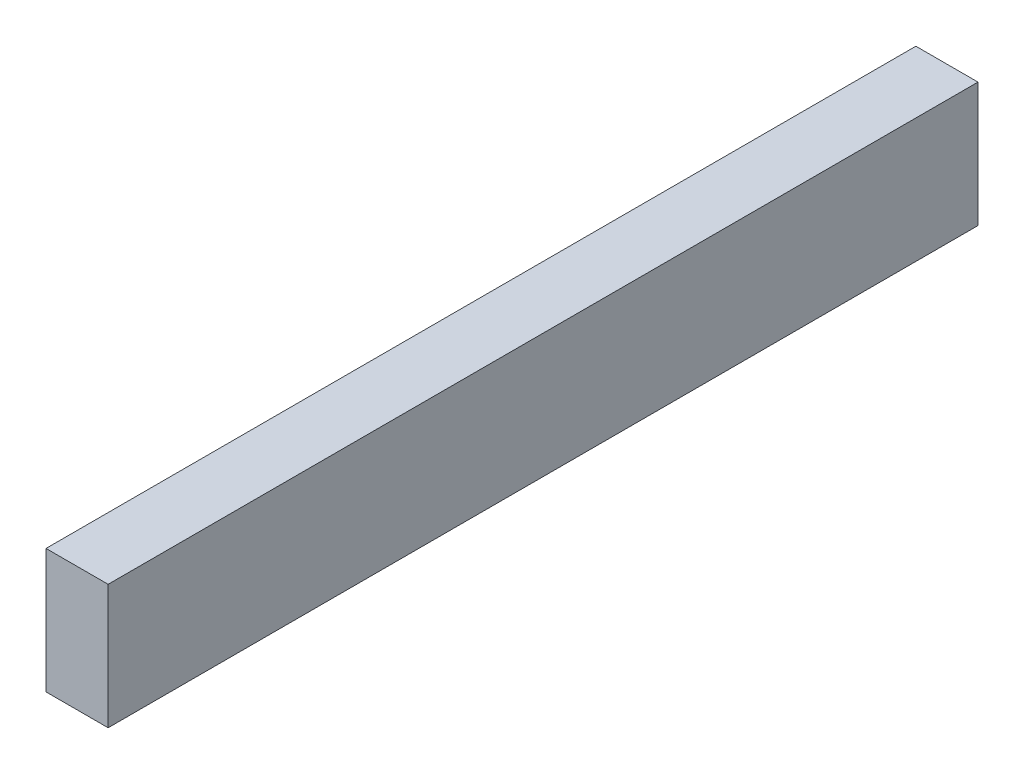
ISO-10303-21;
HEADER;
FILE_DESCRIPTION(('STEP AP214'),'2;1');
FILE_NAME('part.step','',(''),(''),'','','');
FILE_SCHEMA(('AUTOMOTIVE_DESIGN { 1 0 10303 214 1 1 1 1 }'));
ENDSEC;
DATA;
#1=APPLICATION_CONTEXT('core data for automotive mechanical design processes');
#2=APPLICATION_PROTOCOL_DEFINITION('international standard','automotive_design',2000,#1);
#3=PRODUCT_CONTEXT('',#1,'mechanical');
#4=PRODUCT('Part','Part','',(#3));
#5=PRODUCT_RELATED_PRODUCT_CATEGORY('part','',(#4));
#6=PRODUCT_DEFINITION_FORMATION('','',#4);
#7=PRODUCT_DEFINITION_CONTEXT('part definition',#1,'design');
#8=PRODUCT_DEFINITION('design','',#6,#7);
#9=PRODUCT_DEFINITION_SHAPE('','',#8);
#10=(LENGTH_UNIT() NAMED_UNIT(*) SI_UNIT(.MILLI.,.METRE.));
#11=(NAMED_UNIT(*) PLANE_ANGLE_UNIT() SI_UNIT($,.RADIAN.));
#12=(NAMED_UNIT(*) SI_UNIT($,.STERADIAN.) SOLID_ANGLE_UNIT());
#13=UNCERTAINTY_MEASURE_WITH_UNIT(LENGTH_MEASURE(1.E-05),#10,'distance_accuracy_value','');
#14=(GEOMETRIC_REPRESENTATION_CONTEXT(3) GLOBAL_UNCERTAINTY_ASSIGNED_CONTEXT((#13)) GLOBAL_UNIT_ASSIGNED_CONTEXT((#10,
#11,#12)) REPRESENTATION_CONTEXT('',''));
#15=CARTESIAN_POINT('',(0.,0.,0.));
#16=DIRECTION('',(0.,0.,1.));
#17=DIRECTION('',(1.,0.,0.));
#18=AXIS2_PLACEMENT_3D('',#15,#16,#17);
#19=CARTESIAN_POINT('',(25.4,-50.8,711.2));
#20=DIRECTION('',(-1.,0.,0.));
#21=DIRECTION('',(0.,0.,1.));
#22=AXIS2_PLACEMENT_3D('',#19,#20,#21);
#23=PLANE('',#22);
#24=DIRECTION('',(0.,1.,0.));
#25=VECTOR('',#24,1.);
#26=CARTESIAN_POINT('',(25.4,-50.8,0.));
#27=LINE('',#26,#25);
#28=CARTESIAN_POINT('',(25.4,-50.8,0.));
#29=VERTEX_POINT('',#28);
#30=CARTESIAN_POINT('',(25.4,50.8,0.));
#31=VERTEX_POINT('',#30);
#32=EDGE_CURVE('E96',#29,#31,#27,.T.);
#33=ORIENTED_EDGE('',*,*,#32,.T.);
#34=DIRECTION('',(0.,0.,-1.));
#35=VECTOR('',#34,1.);
#36=CARTESIAN_POINT('',(25.4,50.8,711.2));
#37=LINE('',#36,#35);
#38=CARTESIAN_POINT('',(25.4,50.8,711.2));
#39=VERTEX_POINT('',#38);
#40=EDGE_CURVE('E11',#39,#31,#37,.T.);
#41=ORIENTED_EDGE('',*,*,#40,.F.);
#42=DIRECTION('',(0.,1.,0.));
#43=VECTOR('',#42,1.);
#44=CARTESIAN_POINT('',(25.4,-50.8,711.2));
#45=LINE('',#44,#43);
#46=CARTESIAN_POINT('',(25.4,-50.8,711.2));
#47=VERTEX_POINT('',#46);
#48=EDGE_CURVE('E84',#47,#39,#45,.T.);
#49=ORIENTED_EDGE('',*,*,#48,.F.);
#50=DIRECTION('',(0.,0.,-1.));
#51=VECTOR('',#50,1.);
#52=CARTESIAN_POINT('',(25.4,-50.8,711.2));
#53=LINE('',#52,#51);
#54=EDGE_CURVE('E92',#47,#29,#53,.T.);
#55=ORIENTED_EDGE('',*,*,#54,.T.);
#56=EDGE_LOOP('',(#33,#41,#49,#55));
#57=FACE_BOUND('',#56,.T.);
#58=ADVANCED_FACE('F33',(#57),#23,.F.);
#59=CARTESIAN_POINT('',(-25.4,50.8,711.2));
#60=DIRECTION('',(0.,-1.,0.));
#61=DIRECTION('',(0.,0.,-1.));
#62=AXIS2_PLACEMENT_3D('',#59,#60,#61);
#63=PLANE('',#62);
#64=DIRECTION('',(-1.,0.,0.));
#65=VECTOR('',#64,1.);
#66=CARTESIAN_POINT('',(-25.4,50.8,0.));
#67=LINE('',#66,#65);
#68=CARTESIAN_POINT('',(-25.4,50.8,0.));
#69=VERTEX_POINT('',#68);
#70=EDGE_CURVE('E88',#31,#69,#67,.T.);
#71=ORIENTED_EDGE('',*,*,#70,.T.);
#72=DIRECTION('',(0.,0.,-1.));
#73=VECTOR('',#72,1.);
#74=CARTESIAN_POINT('',(-25.4,50.8,711.2));
#75=LINE('',#74,#73);
#76=CARTESIAN_POINT('',(-25.4,50.8,711.2));
#77=VERTEX_POINT('',#76);
#78=EDGE_CURVE('E41',#77,#69,#75,.T.);
#79=ORIENTED_EDGE('',*,*,#78,.F.);
#80=DIRECTION('',(-1.,0.,0.));
#81=VECTOR('',#80,1.);
#82=CARTESIAN_POINT('',(-25.4,50.8,711.2));
#83=LINE('',#82,#81);
#84=EDGE_CURVE('E79',#39,#77,#83,.T.);
#85=ORIENTED_EDGE('',*,*,#84,.F.);
#86=ORIENTED_EDGE('',*,*,#40,.T.);
#87=EDGE_LOOP('',(#71,#79,#85,#86));
#88=FACE_BOUND('',#87,.T.);
#89=ADVANCED_FACE('F87',(#88),#63,.F.);
#90=CARTESIAN_POINT('',(-25.4,-50.8,711.2));
#91=DIRECTION('',(1.,0.,0.));
#92=DIRECTION('',(0.,0.,-1.));
#93=AXIS2_PLACEMENT_3D('',#90,#91,#92);
#94=PLANE('',#93);
#95=DIRECTION('',(0.,-1.,0.));
#96=VECTOR('',#95,1.);
#97=CARTESIAN_POINT('',(-25.4,-50.8,0.));
#98=LINE('',#97,#96);
#99=CARTESIAN_POINT('',(-25.4,-50.8,0.));
#100=VERTEX_POINT('',#99);
#101=EDGE_CURVE('E66',#69,#100,#98,.T.);
#102=ORIENTED_EDGE('',*,*,#101,.T.);
#103=DIRECTION('',(0.,0.,-1.));
#104=VECTOR('',#103,1.);
#105=CARTESIAN_POINT('',(-25.4,-50.8,711.2));
#106=LINE('',#105,#104);
#107=CARTESIAN_POINT('',(-25.4,-50.8,711.2));
#108=VERTEX_POINT('',#107);
#109=EDGE_CURVE('E89',#108,#100,#106,.T.);
#110=ORIENTED_EDGE('',*,*,#109,.F.);
#111=DIRECTION('',(0.,-1.,0.));
#112=VECTOR('',#111,1.);
#113=CARTESIAN_POINT('',(-25.4,-50.8,711.2));
#114=LINE('',#113,#112);
#115=EDGE_CURVE('E82',#77,#108,#114,.T.);
#116=ORIENTED_EDGE('',*,*,#115,.F.);
#117=ORIENTED_EDGE('',*,*,#78,.T.);
#118=EDGE_LOOP('',(#102,#110,#116,#117));
#119=FACE_BOUND('',#118,.T.);
#120=ADVANCED_FACE('F90',(#119),#94,.F.);
#121=CARTESIAN_POINT('',(-25.4,-50.8,711.2));
#122=DIRECTION('',(0.,1.,0.));
#123=DIRECTION('',(0.,0.,1.));
#124=AXIS2_PLACEMENT_3D('',#121,#122,#123);
#125=PLANE('',#124);
#126=DIRECTION('',(1.,0.,0.));
#127=VECTOR('',#126,1.);
#128=CARTESIAN_POINT('',(-25.4,-50.8,0.));
#129=LINE('',#128,#127);
#130=EDGE_CURVE('E72',#100,#29,#129,.T.);
#131=ORIENTED_EDGE('',*,*,#130,.T.);
#132=ORIENTED_EDGE('',*,*,#54,.F.);
#133=DIRECTION('',(1.,0.,0.));
#134=VECTOR('',#133,1.);
#135=CARTESIAN_POINT('',(-25.4,-50.8,711.2));
#136=LINE('',#135,#134);
#137=EDGE_CURVE('E49',#108,#47,#136,.T.);
#138=ORIENTED_EDGE('',*,*,#137,.F.);
#139=ORIENTED_EDGE('',*,*,#109,.T.);
#140=EDGE_LOOP('',(#131,#132,#138,#139));
#141=FACE_BOUND('',#140,.T.);
#142=ADVANCED_FACE('F103',(#141),#125,.F.);
#143=CARTESIAN_POINT('',(0.,0.,711.2));
#144=DIRECTION('',(0.,0.,-1.));
#145=DIRECTION('',(-1.,0.,0.));
#146=AXIS2_PLACEMENT_3D('',#143,#144,#145);
#147=PLANE('',#146);
#148=ORIENTED_EDGE('',*,*,#48,.T.);
#149=ORIENTED_EDGE('',*,*,#84,.T.);
#150=ORIENTED_EDGE('',*,*,#115,.T.);
#151=ORIENTED_EDGE('',*,*,#137,.T.);
#152=EDGE_LOOP('',(#148,#149,#150,#151));
#153=FACE_BOUND('',#152,.T.);
#154=ADVANCED_FACE('F80',(#153),#147,.F.);
#155=CARTESIAN_POINT('',(0.,0.,0.));
#156=DIRECTION('',(0.,0.,-1.));
#157=DIRECTION('',(-1.,0.,0.));
#158=AXIS2_PLACEMENT_3D('',#155,#156,#157);
#159=PLANE('',#158);
#160=ORIENTED_EDGE('',*,*,#32,.F.);
#161=ORIENTED_EDGE('',*,*,#130,.F.);
#162=ORIENTED_EDGE('',*,*,#101,.F.);
#163=ORIENTED_EDGE('',*,*,#70,.F.);
#164=EDGE_LOOP('',(#160,#161,#162,#163));
#165=FACE_BOUND('',#164,.T.);
#166=ADVANCED_FACE('F106',(#165),#159,.T.);
#167=CLOSED_SHELL('',(#58,#89,#120,#142,#154,#166));
#168=MANIFOLD_SOLID_BREP('B2',#167);
#169=ADVANCED_BREP_SHAPE_REPRESENTATION('',(#18,#168),#14);
#170=SHAPE_DEFINITION_REPRESENTATION(#9,#169);
ENDSEC;
END-ISO-10303-21;
